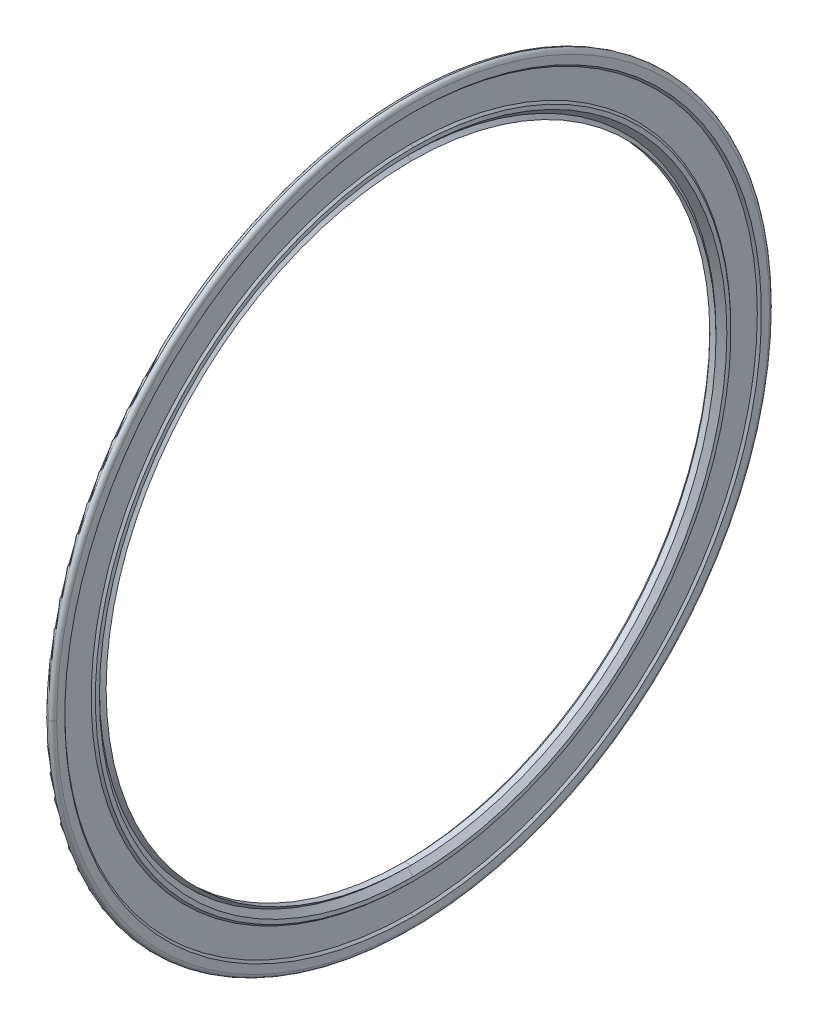
ISO-10303-21;
HEADER;
FILE_DESCRIPTION(('STEP AP214'),'2;1');
FILE_NAME('part.step','',(''),(''),'','','');
FILE_SCHEMA(('AUTOMOTIVE_DESIGN { 1 0 10303 214 1 1 1 1 }'));
ENDSEC;
DATA;
#1=APPLICATION_CONTEXT('core data for automotive mechanical design processes');
#2=APPLICATION_PROTOCOL_DEFINITION('international standard','automotive_design',2000,#1);
#3=PRODUCT_CONTEXT('',#1,'mechanical');
#4=PRODUCT('Part','Part','',(#3));
#5=PRODUCT_RELATED_PRODUCT_CATEGORY('part','',(#4));
#6=PRODUCT_DEFINITION_FORMATION('','',#4);
#7=PRODUCT_DEFINITION_CONTEXT('part definition',#1,'design');
#8=PRODUCT_DEFINITION('design','',#6,#7);
#9=PRODUCT_DEFINITION_SHAPE('','',#8);
#10=(LENGTH_UNIT() NAMED_UNIT(*) SI_UNIT(.MILLI.,.METRE.));
#11=(NAMED_UNIT(*) PLANE_ANGLE_UNIT() SI_UNIT($,.RADIAN.));
#12=(NAMED_UNIT(*) SI_UNIT($,.STERADIAN.) SOLID_ANGLE_UNIT());
#13=UNCERTAINTY_MEASURE_WITH_UNIT(LENGTH_MEASURE(1.E-05),#10,'distance_accuracy_value','');
#14=(GEOMETRIC_REPRESENTATION_CONTEXT(3) GLOBAL_UNCERTAINTY_ASSIGNED_CONTEXT((#13)) GLOBAL_UNIT_ASSIGNED_CONTEXT((#10,
#11,#12)) REPRESENTATION_CONTEXT('',''));
#15=CARTESIAN_POINT('',(0.,0.,0.));
#16=DIRECTION('',(0.,0.,1.));
#17=DIRECTION('',(1.,0.,0.));
#18=AXIS2_PLACEMENT_3D('',#15,#16,#17);
#19=CARTESIAN_POINT('',(3.943,9.732435,0.));
#20=DIRECTION('',(1.,0.,0.));
#21=DIRECTION('',(0.,0.,1.));
#22=AXIS2_PLACEMENT_3D('',#19,#20,#21);
#23=PLANE('',#22);
#24=CARTESIAN_POINT('',(3.943,0.,0.));
#25=DIRECTION('',(-1.,0.,0.));
#26=DIRECTION('',(0.,1.,0.));
#27=AXIS2_PLACEMENT_3D('',#24,#25,#26);
#28=CIRCLE('',#27,9.620035);
#29=CARTESIAN_POINT('',(3.943,9.620035,0.));
#30=VERTEX_POINT('',#29);
#31=CARTESIAN_POINT('',(3.943,-9.620035,0.));
#32=VERTEX_POINT('',#31);
#33=EDGE_CURVE('E11',#30,#32,#28,.T.);
#34=ORIENTED_EDGE('',*,*,#33,.T.);
#35=CARTESIAN_POINT('',(3.943,0.,0.));
#36=DIRECTION('',(-1.,0.,0.));
#37=DIRECTION('',(0.,1.,0.));
#38=AXIS2_PLACEMENT_3D('',#35,#36,#37);
#39=CIRCLE('',#38,9.620035);
#40=EDGE_CURVE('E259',#32,#30,#39,.T.);
#41=ORIENTED_EDGE('',*,*,#40,.T.);
#42=EDGE_LOOP('',(#34,#41));
#43=FACE_BOUND('',#42,.T.);
#44=CARTESIAN_POINT('',(3.943,0.,0.));
#45=DIRECTION('',(-1.,0.,0.));
#46=DIRECTION('',(0.,1.,0.));
#47=AXIS2_PLACEMENT_3D('',#44,#45,#46);
#48=CIRCLE('',#47,9.844835);
#49=CARTESIAN_POINT('',(3.943,0.,9.844835));
#50=VERTEX_POINT('',#49);
#51=CARTESIAN_POINT('',(3.943,0.,-9.844835));
#52=VERTEX_POINT('',#51);
#53=EDGE_CURVE('E224',#50,#52,#48,.T.);
#54=ORIENTED_EDGE('',*,*,#53,.F.);
#55=CARTESIAN_POINT('',(3.943,0.,0.));
#56=DIRECTION('',(-1.,0.,0.));
#57=DIRECTION('',(0.,1.,0.));
#58=AXIS2_PLACEMENT_3D('',#55,#56,#57);
#59=CIRCLE('',#58,9.844835);
#60=EDGE_CURVE('E228',#52,#50,#59,.T.);
#61=ORIENTED_EDGE('',*,*,#60,.F.);
#62=EDGE_LOOP('',(#54,#61));
#63=FACE_BOUND('',#62,.T.);
#64=ADVANCED_FACE('F16',(#43,#63),#23,.T.);
#65=CARTESIAN_POINT('',(3.9145,0.,0.));
#66=DIRECTION('',(1.,0.,0.));
#67=DIRECTION('',(0.,1.,0.));
#68=AXIS2_PLACEMENT_3D('',#65,#66,#67);
#69=CONICAL_SURFACE('',#68,9.591535,0.785398163397451);
#70=DIRECTION('',(-0.707106781186545,-0.70710678118655,0.));
#71=VECTOR('',#70,1.);
#72=CARTESIAN_POINT('',(3.9145,9.591535,0.));
#73=LINE('',#72,#71);
#74=CARTESIAN_POINT('',(3.886,9.563035,0.));
#75=VERTEX_POINT('',#74);
#76=EDGE_CURVE('E234',#30,#75,#73,.T.);
#77=ORIENTED_EDGE('',*,*,#76,.T.);
#78=CARTESIAN_POINT('',(3.886,0.,0.));
#79=DIRECTION('',(-1.,0.,0.));
#80=DIRECTION('',(0.,1.,0.));
#81=AXIS2_PLACEMENT_3D('',#78,#79,#80);
#82=CIRCLE('',#81,9.563035);
#83=CARTESIAN_POINT('',(3.886,-9.563035,0.));
#84=VERTEX_POINT('',#83);
#85=EDGE_CURVE('E19',#75,#84,#82,.T.);
#86=ORIENTED_EDGE('',*,*,#85,.T.);
#87=DIRECTION('',(0.707106781186545,-0.70710678118655,0.));
#88=VECTOR('',#87,1.);
#89=CARTESIAN_POINT('',(3.9145,-9.591535,0.));
#90=LINE('',#89,#88);
#91=EDGE_CURVE('E261',#84,#32,#90,.T.);
#92=ORIENTED_EDGE('',*,*,#91,.T.);
#93=ORIENTED_EDGE('',*,*,#33,.F.);
#94=EDGE_LOOP('',(#77,#86,#92,#93));
#95=FACE_BOUND('',#94,.T.);
#96=ADVANCED_FACE('F207',(#95),#69,.F.);
#97=CARTESIAN_POINT('',(3.886,9.198535,0.));
#98=DIRECTION('',(1.,0.,0.));
#99=DIRECTION('',(0.,0.,1.));
#100=AXIS2_PLACEMENT_3D('',#97,#98,#99);
#101=PLANE('',#100);
#102=CARTESIAN_POINT('',(3.886,0.,0.));
#103=DIRECTION('',(-1.,0.,0.));
#104=DIRECTION('',(0.,1.,0.));
#105=AXIS2_PLACEMENT_3D('',#102,#103,#104);
#106=CIRCLE('',#105,8.834035);
#107=CARTESIAN_POINT('',(3.886,8.834035,0.));
#108=VERTEX_POINT('',#107);
#109=CARTESIAN_POINT('',(3.886,-8.834035,0.));
#110=VERTEX_POINT('',#109);
#111=EDGE_CURVE('E253',#108,#110,#106,.T.);
#112=ORIENTED_EDGE('',*,*,#111,.T.);
#113=CARTESIAN_POINT('',(3.886,0.,0.));
#114=DIRECTION('',(-1.,0.,0.));
#115=DIRECTION('',(0.,1.,0.));
#116=AXIS2_PLACEMENT_3D('',#113,#114,#115);
#117=CIRCLE('',#116,8.834035);
#118=EDGE_CURVE('E118',#110,#108,#117,.T.);
#119=ORIENTED_EDGE('',*,*,#118,.T.);
#120=EDGE_LOOP('',(#112,#119));
#121=FACE_BOUND('',#120,.T.);
#122=ORIENTED_EDGE('',*,*,#85,.F.);
#123=CARTESIAN_POINT('',(3.886,0.,0.));
#124=DIRECTION('',(-1.,0.,0.));
#125=DIRECTION('',(0.,1.,0.));
#126=AXIS2_PLACEMENT_3D('',#123,#124,#125);
#127=CIRCLE('',#126,9.563035);
#128=EDGE_CURVE('E268',#84,#75,#127,.T.);
#129=ORIENTED_EDGE('',*,*,#128,.F.);
#130=EDGE_LOOP('',(#122,#129));
#131=FACE_BOUND('',#130,.T.);
#132=ADVANCED_FACE('F212',(#121,#131),#101,.T.);
#133=CARTESIAN_POINT('',(3.9145,0.,0.));
#134=DIRECTION('',(-1.,0.,0.));
#135=DIRECTION('',(0.,1.,0.));
#136=AXIS2_PLACEMENT_3D('',#133,#134,#135);
#137=CONICAL_SURFACE('',#136,8.805535,0.785398163397451);
#138=DIRECTION('',(-0.707106781186545,0.70710678118655,0.));
#139=VECTOR('',#138,1.);
#140=CARTESIAN_POINT('',(3.9145,8.805535,0.));
#141=LINE('',#140,#139);
#142=CARTESIAN_POINT('',(3.943,8.777035,0.));
#143=VERTEX_POINT('',#142);
#144=EDGE_CURVE('E272',#143,#108,#141,.T.);
#145=ORIENTED_EDGE('',*,*,#144,.T.);
#146=ORIENTED_EDGE('',*,*,#118,.F.);
#147=DIRECTION('',(0.707106781186545,0.70710678118655,0.));
#148=VECTOR('',#147,1.);
#149=CARTESIAN_POINT('',(3.9145,-8.805535,0.));
#150=LINE('',#149,#148);
#151=CARTESIAN_POINT('',(3.943,-8.777035,0.));
#152=VERTEX_POINT('',#151);
#153=EDGE_CURVE('E277',#110,#152,#150,.T.);
#154=ORIENTED_EDGE('',*,*,#153,.T.);
#155=CARTESIAN_POINT('',(3.943,0.,0.));
#156=DIRECTION('',(-1.,0.,0.));
#157=DIRECTION('',(0.,1.,0.));
#158=AXIS2_PLACEMENT_3D('',#155,#156,#157);
#159=CIRCLE('',#158,8.777035);
#160=EDGE_CURVE('E120',#152,#143,#159,.T.);
#161=ORIENTED_EDGE('',*,*,#160,.T.);
#162=EDGE_LOOP('',(#145,#146,#154,#161));
#163=FACE_BOUND('',#162,.T.);
#164=ADVANCED_FACE('F509',(#163),#137,.T.);
#165=CARTESIAN_POINT('',(3.943,8.720835,0.));
#166=DIRECTION('',(1.,0.,0.));
#167=DIRECTION('',(0.,0.,1.));
#168=AXIS2_PLACEMENT_3D('',#165,#166,#167);
#169=PLANE('',#168);
#170=CARTESIAN_POINT('',(3.943,0.,0.));
#171=DIRECTION('',(-1.,0.,0.));
#172=DIRECTION('',(0.,1.,0.));
#173=AXIS2_PLACEMENT_3D('',#170,#171,#172);
#174=CIRCLE('',#173,8.664635);
#175=CARTESIAN_POINT('',(3.943,8.664635,0.));
#176=VERTEX_POINT('',#175);
#177=CARTESIAN_POINT('',(3.943,-8.664635,0.));
#178=VERTEX_POINT('',#177);
#179=EDGE_CURVE('E128',#176,#178,#174,.T.);
#180=ORIENTED_EDGE('',*,*,#179,.T.);
#181=CARTESIAN_POINT('',(3.943,0.,0.));
#182=DIRECTION('',(-1.,0.,0.));
#183=DIRECTION('',(0.,1.,0.));
#184=AXIS2_PLACEMENT_3D('',#181,#182,#183);
#185=CIRCLE('',#184,8.664635);
#186=EDGE_CURVE('E262',#178,#176,#185,.T.);
#187=ORIENTED_EDGE('',*,*,#186,.T.);
#188=EDGE_LOOP('',(#180,#187));
#189=FACE_BOUND('',#188,.T.);
#190=CARTESIAN_POINT('',(3.943,0.,0.));
#191=DIRECTION('',(-1.,0.,0.));
#192=DIRECTION('',(0.,1.,0.));
#193=AXIS2_PLACEMENT_3D('',#190,#191,#192);
#194=CIRCLE('',#193,8.777035);
#195=EDGE_CURVE('E274',#143,#152,#194,.T.);
#196=ORIENTED_EDGE('',*,*,#195,.F.);
#197=ORIENTED_EDGE('',*,*,#160,.F.);
#198=EDGE_LOOP('',(#196,#197));
#199=FACE_BOUND('',#198,.T.);
#200=ADVANCED_FACE('F297',(#189,#199),#169,.T.);
#201=CARTESIAN_POINT('',(3.86798375,0.,0.));
#202=DIRECTION('',(1.,0.,0.));
#203=DIRECTION('',(0.,1.,0.));
#204=AXIS2_PLACEMENT_3D('',#201,#202,#203);
#205=CONICAL_SURFACE('',#204,8.58961875,0.785398163397449);
#206=DIRECTION('',(-0.707106781186547,-0.707106781186548,0.));
#207=VECTOR('',#206,1.);
#208=CARTESIAN_POINT('',(3.86798375,8.58961875,0.));
#209=LINE('',#208,#207);
#210=CARTESIAN_POINT('',(3.7929675,8.5146025,0.));
#211=VERTEX_POINT('',#210);
#212=EDGE_CURVE('E266',#176,#211,#209,.T.);
#213=ORIENTED_EDGE('',*,*,#212,.T.);
#214=CARTESIAN_POINT('',(3.7929675,0.,0.));
#215=DIRECTION('',(-1.,0.,0.));
#216=DIRECTION('',(0.,1.,0.));
#217=AXIS2_PLACEMENT_3D('',#214,#215,#216);
#218=CIRCLE('',#217,8.5146025);
#219=CARTESIAN_POINT('',(3.7929675,-8.5146025,0.));
#220=VERTEX_POINT('',#219);
#221=EDGE_CURVE('E151',#211,#220,#218,.T.);
#222=ORIENTED_EDGE('',*,*,#221,.T.);
#223=DIRECTION('',(0.707106781186547,-0.707106781186548,0.));
#224=VECTOR('',#223,1.);
#225=CARTESIAN_POINT('',(3.86798375,-8.58961875,0.));
#226=LINE('',#225,#224);
#227=EDGE_CURVE('E265',#220,#178,#226,.T.);
#228=ORIENTED_EDGE('',*,*,#227,.T.);
#229=ORIENTED_EDGE('',*,*,#179,.F.);
#230=EDGE_LOOP('',(#213,#222,#228,#229));
#231=FACE_BOUND('',#230,.T.);
#232=ADVANCED_FACE('F293',(#231),#205,.F.);
#233=CARTESIAN_POINT('',(3.83948375,0.,0.));
#234=DIRECTION('',(-1.,0.,0.));
#235=DIRECTION('',(0.,1.,0.));
#236=AXIS2_PLACEMENT_3D('',#233,#234,#235);
#237=CONICAL_SURFACE('',#236,8.46808625,0.785398163397448);
#238=DIRECTION('',(-0.707106781186548,0.707106781186547,0.));
#239=VECTOR('',#238,1.);
#240=CARTESIAN_POINT('',(3.83948375,8.46808625,0.));
#241=LINE('',#240,#239);
#242=CARTESIAN_POINT('',(3.886,8.42157,0.));
#243=VERTEX_POINT('',#242);
#244=EDGE_CURVE('E142',#243,#211,#241,.T.);
#245=ORIENTED_EDGE('',*,*,#244,.T.);
#246=CARTESIAN_POINT('',(3.7929675,0.,0.));
#247=DIRECTION('',(-1.,0.,0.));
#248=DIRECTION('',(0.,1.,0.));
#249=AXIS2_PLACEMENT_3D('',#246,#247,#248);
#250=CIRCLE('',#249,8.5146025);
#251=EDGE_CURVE('E140',#220,#211,#250,.T.);
#252=ORIENTED_EDGE('',*,*,#251,.F.);
#253=DIRECTION('',(0.707106781186548,0.707106781186547,0.));
#254=VECTOR('',#253,1.);
#255=CARTESIAN_POINT('',(3.83948375,-8.46808625,0.));
#256=LINE('',#255,#254);
#257=CARTESIAN_POINT('',(3.886,-8.42157,0.));
#258=VERTEX_POINT('',#257);
#259=EDGE_CURVE('E148',#220,#258,#256,.T.);
#260=ORIENTED_EDGE('',*,*,#259,.T.);
#261=CARTESIAN_POINT('',(3.886,0.,0.));
#262=DIRECTION('',(-1.,0.,0.));
#263=DIRECTION('',(0.,1.,0.));
#264=AXIS2_PLACEMENT_3D('',#261,#262,#263);
#265=CIRCLE('',#264,8.42157);
#266=EDGE_CURVE('E156',#258,#243,#265,.T.);
#267=ORIENTED_EDGE('',*,*,#266,.T.);
#268=EDGE_LOOP('',(#245,#252,#260,#267));
#269=FACE_BOUND('',#268,.T.);
#270=ADVANCED_FACE('F486',(#269),#237,.T.);
#271=CARTESIAN_POINT('',(3.8005,0.,0.));
#272=DIRECTION('',(-1.,0.,0.));
#273=DIRECTION('',(0.,1.,0.));
#274=AXIS2_PLACEMENT_3D('',#271,#272,#273);
#275=CYLINDRICAL_SURFACE('',#274,8.42157);
#276=DIRECTION('',(-1.,0.,0.));
#277=VECTOR('',#276,1.);
#278=CARTESIAN_POINT('',(3.8005,8.42157,0.));
#279=LINE('',#278,#277);
#280=CARTESIAN_POINT('',(3.715,8.42157,0.));
#281=VERTEX_POINT('',#280);
#282=EDGE_CURVE('E153',#243,#281,#279,.T.);
#283=ORIENTED_EDGE('',*,*,#282,.T.);
#284=CARTESIAN_POINT('',(3.715,0.,0.));
#285=DIRECTION('',(-1.,0.,0.));
#286=DIRECTION('',(0.,1.,0.));
#287=AXIS2_PLACEMENT_3D('',#284,#285,#286);
#288=CIRCLE('',#287,8.42157);
#289=CARTESIAN_POINT('',(3.715,-8.42157,0.));
#290=VERTEX_POINT('',#289);
#291=EDGE_CURVE('E109',#281,#290,#288,.T.);
#292=ORIENTED_EDGE('',*,*,#291,.T.);
#293=DIRECTION('',(1.,0.,0.));
#294=VECTOR('',#293,1.);
#295=CARTESIAN_POINT('',(3.8005,-8.42157,0.));
#296=LINE('',#295,#294);
#297=EDGE_CURVE('E158',#290,#258,#296,.T.);
#298=ORIENTED_EDGE('',*,*,#297,.T.);
#299=CARTESIAN_POINT('',(3.886,0.,0.));
#300=DIRECTION('',(-1.,0.,0.));
#301=DIRECTION('',(0.,1.,0.));
#302=AXIS2_PLACEMENT_3D('',#299,#300,#301);
#303=CIRCLE('',#302,8.42157);
#304=EDGE_CURVE('E145',#243,#258,#303,.T.);
#305=ORIENTED_EDGE('',*,*,#304,.F.);
#306=EDGE_LOOP('',(#283,#292,#298,#305));
#307=FACE_BOUND('',#306,.T.);
#308=ADVANCED_FACE('F478',(#307),#275,.F.);
#309=CARTESIAN_POINT('',(3.66848375,0.,0.));
#310=DIRECTION('',(-1.,0.,0.));
#311=DIRECTION('',(0.,1.,0.));
#312=AXIS2_PLACEMENT_3D('',#309,#310,#311);
#313=CONICAL_SURFACE('',#312,8.46808625,0.785398163397444);
#314=DIRECTION('',(-0.707106781186551,0.707106781186544,0.));
#315=VECTOR('',#314,1.);
#316=CARTESIAN_POINT('',(3.66848375,8.46808625,0.));
#317=LINE('',#316,#315);
#318=CARTESIAN_POINT('',(3.6219675,8.5146025,0.));
#319=VERTEX_POINT('',#318);
#320=EDGE_CURVE('E163',#281,#319,#317,.T.);
#321=ORIENTED_EDGE('',*,*,#320,.T.);
#322=CARTESIAN_POINT('',(3.6219675,0.,0.));
#323=DIRECTION('',(-1.,0.,0.));
#324=DIRECTION('',(0.,1.,0.));
#325=AXIS2_PLACEMENT_3D('',#322,#323,#324);
#326=CIRCLE('',#325,8.5146025);
#327=CARTESIAN_POINT('',(3.6219675,-8.5146025,0.));
#328=VERTEX_POINT('',#327);
#329=EDGE_CURVE('E179',#319,#328,#326,.T.);
#330=ORIENTED_EDGE('',*,*,#329,.T.);
#331=DIRECTION('',(0.707106781186551,0.707106781186544,0.));
#332=VECTOR('',#331,1.);
#333=CARTESIAN_POINT('',(3.66848375,-8.46808625,0.));
#334=LINE('',#333,#332);
#335=EDGE_CURVE('E166',#328,#290,#334,.T.);
#336=ORIENTED_EDGE('',*,*,#335,.T.);
#337=ORIENTED_EDGE('',*,*,#291,.F.);
#338=EDGE_LOOP('',(#321,#330,#336,#337));
#339=FACE_BOUND('',#338,.T.);
#340=ADVANCED_FACE('F337',(#339),#313,.F.);
#341=CARTESIAN_POINT('',(3.69698375,0.,0.));
#342=DIRECTION('',(1.,0.,0.));
#343=DIRECTION('',(0.,1.,0.));
#344=AXIS2_PLACEMENT_3D('',#341,#342,#343);
#345=CONICAL_SURFACE('',#344,8.58961875,0.785398163397446);
#346=DIRECTION('',(-0.707106781186549,-0.707106781186546,0.));
#347=VECTOR('',#346,1.);
#348=CARTESIAN_POINT('',(3.69698375,8.58961875,0.));
#349=LINE('',#348,#347);
#350=CARTESIAN_POINT('',(3.772,8.664635,0.));
#351=VERTEX_POINT('',#350);
#352=EDGE_CURVE('E172',#351,#319,#349,.T.);
#353=ORIENTED_EDGE('',*,*,#352,.T.);
#354=CARTESIAN_POINT('',(3.6219675,0.,0.));
#355=DIRECTION('',(-1.,0.,0.));
#356=DIRECTION('',(0.,1.,0.));
#357=AXIS2_PLACEMENT_3D('',#354,#355,#356);
#358=CIRCLE('',#357,8.5146025);
#359=EDGE_CURVE('E169',#328,#319,#358,.T.);
#360=ORIENTED_EDGE('',*,*,#359,.F.);
#361=DIRECTION('',(0.707106781186549,-0.707106781186546,0.));
#362=VECTOR('',#361,1.);
#363=CARTESIAN_POINT('',(3.69698375,-8.58961875,0.));
#364=LINE('',#363,#362);
#365=CARTESIAN_POINT('',(3.772,-8.664635,0.));
#366=VERTEX_POINT('',#365);
#367=EDGE_CURVE('E178',#328,#366,#364,.T.);
#368=ORIENTED_EDGE('',*,*,#367,.T.);
#369=CARTESIAN_POINT('',(3.772,0.,0.));
#370=DIRECTION('',(-1.,0.,0.));
#371=DIRECTION('',(0.,1.,0.));
#372=AXIS2_PLACEMENT_3D('',#369,#370,#371);
#373=CIRCLE('',#372,8.664635);
#374=EDGE_CURVE('E182',#366,#351,#373,.T.);
#375=ORIENTED_EDGE('',*,*,#374,.T.);
#376=EDGE_LOOP('',(#353,#360,#368,#375));
#377=FACE_BOUND('',#376,.T.);
#378=ADVANCED_FACE('F202',(#377),#345,.T.);
#379=CARTESIAN_POINT('',(3.715,0.,0.));
#380=DIRECTION('',(-1.,0.,0.));
#381=DIRECTION('',(0.,1.,0.));
#382=AXIS2_PLACEMENT_3D('',#379,#380,#381);
#383=CONICAL_SURFACE('',#382,8.721635,0.785398163397451);
#384=DIRECTION('',(-0.707106781186546,0.70710678118655,0.));
#385=VECTOR('',#384,1.);
#386=CARTESIAN_POINT('',(3.715,8.721635,0.));
#387=LINE('',#386,#385);
#388=CARTESIAN_POINT('',(3.658,8.778635,0.));
#389=VERTEX_POINT('',#388);
#390=EDGE_CURVE('E181',#351,#389,#387,.T.);
#391=ORIENTED_EDGE('',*,*,#390,.T.);
#392=CARTESIAN_POINT('',(3.658,0.,0.));
#393=DIRECTION('',(-1.,0.,0.));
#394=DIRECTION('',(0.,1.,0.));
#395=AXIS2_PLACEMENT_3D('',#392,#393,#394);
#396=CIRCLE('',#395,8.778635);
#397=CARTESIAN_POINT('',(3.658,-8.778635,0.));
#398=VERTEX_POINT('',#397);
#399=EDGE_CURVE('E117',#389,#398,#396,.T.);
#400=ORIENTED_EDGE('',*,*,#399,.T.);
#401=DIRECTION('',(0.707106781186546,0.70710678118655,0.));
#402=VECTOR('',#401,1.);
#403=CARTESIAN_POINT('',(3.715,-8.721635,0.));
#404=LINE('',#403,#402);
#405=EDGE_CURVE('E184',#398,#366,#404,.T.);
#406=ORIENTED_EDGE('',*,*,#405,.T.);
#407=CARTESIAN_POINT('',(3.772,0.,0.));
#408=DIRECTION('',(-1.,0.,0.));
#409=DIRECTION('',(0.,1.,0.));
#410=AXIS2_PLACEMENT_3D('',#407,#408,#409);
#411=CIRCLE('',#410,8.664635);
#412=EDGE_CURVE('E175',#351,#366,#411,.T.);
#413=ORIENTED_EDGE('',*,*,#412,.F.);
#414=EDGE_LOOP('',(#391,#400,#406,#413));
#415=FACE_BOUND('',#414,.T.);
#416=ADVANCED_FACE('F193',(#415),#383,.F.);
#417=CARTESIAN_POINT('',(3.658,9.15509032196187,0.));
#418=DIRECTION('',(-1.,0.,0.));
#419=DIRECTION('',(0.,0.,1.));
#420=AXIS2_PLACEMENT_3D('',#417,#418,#419);
#421=PLANE('',#420);
#422=ORIENTED_EDGE('',*,*,#399,.F.);
#423=CARTESIAN_POINT('',(3.658,0.,0.));
#424=DIRECTION('',(-1.,0.,0.));
#425=DIRECTION('',(0.,1.,0.));
#426=AXIS2_PLACEMENT_3D('',#423,#424,#425);
#427=CIRCLE('',#426,8.778635);
#428=EDGE_CURVE('E187',#398,#389,#427,.T.);
#429=ORIENTED_EDGE('',*,*,#428,.F.);
#430=EDGE_LOOP('',(#422,#429));
#431=FACE_BOUND('',#430,.T.);
#432=CARTESIAN_POINT('',(3.658,0.,0.));
#433=DIRECTION('',(-1.,0.,0.));
#434=DIRECTION('',(0.,1.,0.));
#435=AXIS2_PLACEMENT_3D('',#432,#433,#434);
#436=CIRCLE('',#435,9.53154564392374);
#437=CARTESIAN_POINT('',(3.658,9.53154564392374,0.));
#438=VERTEX_POINT('',#437);
#439=CARTESIAN_POINT('',(3.658,-9.53154564392375,0.));
#440=VERTEX_POINT('',#439);
#441=EDGE_CURVE('E99',#438,#440,#436,.T.);
#442=ORIENTED_EDGE('',*,*,#441,.T.);
#443=CARTESIAN_POINT('',(3.658,0.,0.));
#444=DIRECTION('',(-1.,0.,0.));
#445=DIRECTION('',(0.,1.,0.));
#446=AXIS2_PLACEMENT_3D('',#443,#444,#445);
#447=CIRCLE('',#446,9.53154564392374);
#448=EDGE_CURVE('E90',#440,#438,#447,.T.);
#449=ORIENTED_EDGE('',*,*,#448,.T.);
#450=EDGE_LOOP('',(#442,#449));
#451=FACE_BOUND('',#450,.T.);
#452=ADVANCED_FACE('F191',(#431,#451),#421,.T.);
#453=CARTESIAN_POINT('',(3.6873659580783,0.,0.));
#454=DIRECTION('',(1.,0.,0.));
#455=DIRECTION('',(0.,1.,0.));
#456=AXIS2_PLACEMENT_3D('',#453,#454,#455);
#457=CONICAL_SURFACE('',#456,9.69808826808889,1.39626340159546);
#458=DIRECTION('',(-0.173648177666929,-0.984807753012208,0.));
#459=VECTOR('',#458,1.);
#460=CARTESIAN_POINT('',(3.6873659580783,9.69808826808889,0.));
#461=LINE('',#460,#459);
#462=CARTESIAN_POINT('',(3.71673191615661,9.86463089225403,0.));
#463=VERTEX_POINT('',#462);
#464=EDGE_CURVE('E106',#463,#438,#461,.T.);
#465=ORIENTED_EDGE('',*,*,#464,.T.);
#466=ORIENTED_EDGE('',*,*,#448,.F.);
#467=DIRECTION('',(0.173648177666929,-0.984807753012208,0.));
#468=VECTOR('',#467,1.);
#469=CARTESIAN_POINT('',(3.6873659580783,-9.69808826808889,0.));
#470=LINE('',#469,#468);
#471=CARTESIAN_POINT('',(3.71673191615661,-9.86463089225403,0.));
#472=VERTEX_POINT('',#471);
#473=EDGE_CURVE('E93',#440,#472,#470,.T.);
#474=ORIENTED_EDGE('',*,*,#473,.T.);
#475=CARTESIAN_POINT('',(3.71673191615661,0.,0.));
#476=DIRECTION('',(-1.,0.,0.));
#477=DIRECTION('',(0.,1.,0.));
#478=AXIS2_PLACEMENT_3D('',#475,#476,#477);
#479=CIRCLE('',#478,9.86463089225403);
#480=CARTESIAN_POINT('',(3.71673191615661,0.,9.86463089225403));
#481=VERTEX_POINT('',#480);
#482=EDGE_CURVE('E32',#472,#481,#479,.T.);
#483=ORIENTED_EDGE('',*,*,#482,.T.);
#484=CARTESIAN_POINT('',(3.71673191615661,0.,0.));
#485=DIRECTION('',(-1.,0.,0.));
#486=DIRECTION('',(0.,1.,0.));
#487=AXIS2_PLACEMENT_3D('',#484,#485,#486);
#488=CIRCLE('',#487,9.86463089225403);
#489=EDGE_CURVE('E114',#481,#463,#488,.T.);
#490=ORIENTED_EDGE('',*,*,#489,.T.);
#491=EDGE_LOOP('',(#465,#466,#474,#483,#490));
#492=FACE_BOUND('',#491,.T.);
#493=ADVANCED_FACE('F95',(#492),#457,.T.);
#494=CARTESIAN_POINT('',(3.829,0.,0.));
#495=DIRECTION('',(-1.,0.,0.));
#496=DIRECTION('',(0.,0.,1.));
#497=AXIS2_PLACEMENT_3D('',#494,#495,#496);
#498=TOROIDAL_SURFACE('',#497,9.844835,0.114);
#499=CARTESIAN_POINT('',(3.829,0.,0.));
#500=DIRECTION('',(-1.,0.,0.));
#501=DIRECTION('',(0.,0.,1.));
#502=AXIS2_PLACEMENT_3D('',#499,#500,#501);
#503=CIRCLE('',#502,9.958835);
#504=CARTESIAN_POINT('',(3.829,0.,-9.958835));
#505=VERTEX_POINT('',#504);
#506=CARTESIAN_POINT('',(3.829,0.,9.958835));
#507=VERTEX_POINT('',#506);
#508=EDGE_CURVE('E249',#505,#507,#503,.T.);
#509=ORIENTED_EDGE('',*,*,#508,.T.);
#510=CARTESIAN_POINT('',(3.829,0.,9.844835));
#511=DIRECTION('',(0.,-1.,0.));
#512=DIRECTION('',(0.,0.,1.));
#513=AXIS2_PLACEMENT_3D('',#510,#511,#512);
#514=CIRCLE('',#513,0.114);
#515=EDGE_CURVE('E88',#507,#481,#514,.T.);
#516=ORIENTED_EDGE('',*,*,#515,.T.);
#517=ORIENTED_EDGE('',*,*,#482,.F.);
#518=CARTESIAN_POINT('',(3.71673191615661,0.,0.));
#519=DIRECTION('',(-1.,0.,0.));
#520=DIRECTION('',(0.,1.,0.));
#521=AXIS2_PLACEMENT_3D('',#518,#519,#520);
#522=CIRCLE('',#521,9.86463089225403);
#523=CARTESIAN_POINT('',(3.71673191615661,0.,-9.86463089225403));
#524=VERTEX_POINT('',#523);
#525=EDGE_CURVE('E85',#524,#472,#522,.T.);
#526=ORIENTED_EDGE('',*,*,#525,.F.);
#527=CARTESIAN_POINT('',(3.829,0.,-9.844835));
#528=DIRECTION('',(0.,-1.,0.));
#529=DIRECTION('',(0.,0.,-1.));
#530=AXIS2_PLACEMENT_3D('',#527,#528,#529);
#531=CIRCLE('',#530,0.114);
#532=EDGE_CURVE('E112',#524,#505,#531,.T.);
#533=ORIENTED_EDGE('',*,*,#532,.T.);
#534=EDGE_LOOP('',(#509,#516,#517,#526,#533));
#535=FACE_BOUND('',#534,.T.);
#536=ADVANCED_FACE('F82',(#535),#498,.T.);
#537=CARTESIAN_POINT('',(3.829,0.,0.));
#538=DIRECTION('',(-1.,0.,0.));
#539=DIRECTION('',(0.,0.,1.));
#540=AXIS2_PLACEMENT_3D('',#537,#538,#539);
#541=TOROIDAL_SURFACE('',#540,9.844835,0.114);
#542=CARTESIAN_POINT('',(3.829,0.,0.));
#543=DIRECTION('',(-1.,0.,0.));
#544=DIRECTION('',(0.,0.,1.));
#545=AXIS2_PLACEMENT_3D('',#542,#543,#544);
#546=CIRCLE('',#545,9.958835);
#547=EDGE_CURVE('E235',#507,#505,#546,.T.);
#548=ORIENTED_EDGE('',*,*,#547,.T.);
#549=ORIENTED_EDGE('',*,*,#532,.F.);
#550=CARTESIAN_POINT('',(3.71673191615661,0.,0.));
#551=DIRECTION('',(-1.,0.,0.));
#552=DIRECTION('',(0.,1.,0.));
#553=AXIS2_PLACEMENT_3D('',#550,#551,#552);
#554=CIRCLE('',#553,9.86463089225403);
#555=EDGE_CURVE('E104',#463,#524,#554,.T.);
#556=ORIENTED_EDGE('',*,*,#555,.F.);
#557=ORIENTED_EDGE('',*,*,#489,.F.);
#558=ORIENTED_EDGE('',*,*,#515,.F.);
#559=EDGE_LOOP('',(#548,#549,#556,#557,#558));
#560=FACE_BOUND('',#559,.T.);
#561=ADVANCED_FACE('F345',(#560),#541,.T.);
#562=CARTESIAN_POINT('',(3.6873659580783,0.,0.));
#563=DIRECTION('',(1.,0.,0.));
#564=DIRECTION('',(0.,1.,0.));
#565=AXIS2_PLACEMENT_3D('',#562,#563,#564);
#566=CONICAL_SURFACE('',#565,9.69808826808889,1.39626340159546);
#567=ORIENTED_EDGE('',*,*,#464,.F.);
#568=ORIENTED_EDGE('',*,*,#555,.T.);
#569=ORIENTED_EDGE('',*,*,#525,.T.);
#570=ORIENTED_EDGE('',*,*,#473,.F.);
#571=ORIENTED_EDGE('',*,*,#441,.F.);
#572=EDGE_LOOP('',(#567,#568,#569,#570,#571));
#573=FACE_BOUND('',#572,.T.);
#574=ADVANCED_FACE('F102',(#573),#566,.T.);
#575=CARTESIAN_POINT('',(3.715,0.,0.));
#576=DIRECTION('',(-1.,0.,0.));
#577=DIRECTION('',(0.,1.,0.));
#578=AXIS2_PLACEMENT_3D('',#575,#576,#577);
#579=CONICAL_SURFACE('',#578,8.721635,0.785398163397451);
#580=ORIENTED_EDGE('',*,*,#390,.F.);
#581=ORIENTED_EDGE('',*,*,#374,.F.);
#582=ORIENTED_EDGE('',*,*,#405,.F.);
#583=ORIENTED_EDGE('',*,*,#428,.T.);
#584=EDGE_LOOP('',(#580,#581,#582,#583));
#585=FACE_BOUND('',#584,.T.);
#586=ADVANCED_FACE('F344',(#585),#579,.F.);
#587=CARTESIAN_POINT('',(3.69698375,0.,0.));
#588=DIRECTION('',(1.,0.,0.));
#589=DIRECTION('',(0.,1.,0.));
#590=AXIS2_PLACEMENT_3D('',#587,#588,#589);
#591=CONICAL_SURFACE('',#590,8.58961875,0.785398163397446);
#592=ORIENTED_EDGE('',*,*,#352,.F.);
#593=ORIENTED_EDGE('',*,*,#412,.T.);
#594=ORIENTED_EDGE('',*,*,#367,.F.);
#595=ORIENTED_EDGE('',*,*,#329,.F.);
#596=EDGE_LOOP('',(#592,#593,#594,#595));
#597=FACE_BOUND('',#596,.T.);
#598=ADVANCED_FACE('F347',(#597),#591,.T.);
#599=CARTESIAN_POINT('',(3.66848375,0.,0.));
#600=DIRECTION('',(-1.,0.,0.));
#601=DIRECTION('',(0.,1.,0.));
#602=AXIS2_PLACEMENT_3D('',#599,#600,#601);
#603=CONICAL_SURFACE('',#602,8.46808625,0.785398163397444);
#604=ORIENTED_EDGE('',*,*,#320,.F.);
#605=CARTESIAN_POINT('',(3.715,0.,0.));
#606=DIRECTION('',(-1.,0.,0.));
#607=DIRECTION('',(0.,1.,0.));
#608=AXIS2_PLACEMENT_3D('',#605,#606,#607);
#609=CIRCLE('',#608,8.42157);
#610=EDGE_CURVE('E160',#290,#281,#609,.T.);
#611=ORIENTED_EDGE('',*,*,#610,.F.);
#612=ORIENTED_EDGE('',*,*,#335,.F.);
#613=ORIENTED_EDGE('',*,*,#359,.T.);
#614=EDGE_LOOP('',(#604,#611,#612,#613));
#615=FACE_BOUND('',#614,.T.);
#616=ADVANCED_FACE('F352',(#615),#603,.F.);
#617=CARTESIAN_POINT('',(3.8005,0.,0.));
#618=DIRECTION('',(-1.,0.,0.));
#619=DIRECTION('',(0.,1.,0.));
#620=AXIS2_PLACEMENT_3D('',#617,#618,#619);
#621=CYLINDRICAL_SURFACE('',#620,8.42157);
#622=ORIENTED_EDGE('',*,*,#282,.F.);
#623=ORIENTED_EDGE('',*,*,#266,.F.);
#624=ORIENTED_EDGE('',*,*,#297,.F.);
#625=ORIENTED_EDGE('',*,*,#610,.T.);
#626=EDGE_LOOP('',(#622,#623,#624,#625));
#627=FACE_BOUND('',#626,.T.);
#628=ADVANCED_FACE('F386',(#627),#621,.F.);
#629=CARTESIAN_POINT('',(3.83948375,0.,0.));
#630=DIRECTION('',(-1.,0.,0.));
#631=DIRECTION('',(0.,1.,0.));
#632=AXIS2_PLACEMENT_3D('',#629,#630,#631);
#633=CONICAL_SURFACE('',#632,8.46808625,0.785398163397448);
#634=ORIENTED_EDGE('',*,*,#244,.F.);
#635=ORIENTED_EDGE('',*,*,#304,.T.);
#636=ORIENTED_EDGE('',*,*,#259,.F.);
#637=ORIENTED_EDGE('',*,*,#221,.F.);
#638=EDGE_LOOP('',(#634,#635,#636,#637));
#639=FACE_BOUND('',#638,.T.);
#640=ADVANCED_FACE('F341',(#639),#633,.T.);
#641=CARTESIAN_POINT('',(3.86798375,0.,0.));
#642=DIRECTION('',(1.,0.,0.));
#643=DIRECTION('',(0.,1.,0.));
#644=AXIS2_PLACEMENT_3D('',#641,#642,#643);
#645=CONICAL_SURFACE('',#644,8.58961875,0.785398163397449);
#646=ORIENTED_EDGE('',*,*,#212,.F.);
#647=ORIENTED_EDGE('',*,*,#186,.F.);
#648=ORIENTED_EDGE('',*,*,#227,.F.);
#649=ORIENTED_EDGE('',*,*,#251,.T.);
#650=EDGE_LOOP('',(#646,#647,#648,#649));
#651=FACE_BOUND('',#650,.T.);
#652=ADVANCED_FACE('F289',(#651),#645,.F.);
#653=CARTESIAN_POINT('',(3.9145,0.,0.));
#654=DIRECTION('',(-1.,0.,0.));
#655=DIRECTION('',(0.,1.,0.));
#656=AXIS2_PLACEMENT_3D('',#653,#654,#655);
#657=CONICAL_SURFACE('',#656,8.805535,0.785398163397451);
#658=ORIENTED_EDGE('',*,*,#144,.F.);
#659=ORIENTED_EDGE('',*,*,#195,.T.);
#660=ORIENTED_EDGE('',*,*,#153,.F.);
#661=ORIENTED_EDGE('',*,*,#111,.F.);
#662=EDGE_LOOP('',(#658,#659,#660,#661));
#663=FACE_BOUND('',#662,.T.);
#664=ADVANCED_FACE('F324',(#663),#657,.T.);
#665=CARTESIAN_POINT('',(3.9145,0.,0.));
#666=DIRECTION('',(1.,0.,0.));
#667=DIRECTION('',(0.,1.,0.));
#668=AXIS2_PLACEMENT_3D('',#665,#666,#667);
#669=CONICAL_SURFACE('',#668,9.591535,0.785398163397451);
#670=ORIENTED_EDGE('',*,*,#76,.F.);
#671=ORIENTED_EDGE('',*,*,#40,.F.);
#672=ORIENTED_EDGE('',*,*,#91,.F.);
#673=ORIENTED_EDGE('',*,*,#128,.T.);
#674=EDGE_LOOP('',(#670,#671,#672,#673));
#675=FACE_BOUND('',#674,.T.);
#676=ADVANCED_FACE('F321',(#675),#669,.F.);
#677=CARTESIAN_POINT('',(3.829,0.,0.));
#678=DIRECTION('',(-1.,0.,0.));
#679=DIRECTION('',(0.,0.,1.));
#680=AXIS2_PLACEMENT_3D('',#677,#678,#679);
#681=TOROIDAL_SURFACE('',#680,9.844835,0.114);
#682=ORIENTED_EDGE('',*,*,#547,.F.);
#683=CARTESIAN_POINT('',(3.829,0.,9.844835));
#684=DIRECTION('',(0.,-1.,0.));
#685=DIRECTION('',(0.,0.,1.));
#686=AXIS2_PLACEMENT_3D('',#683,#684,#685);
#687=CIRCLE('',#686,0.114);
#688=EDGE_CURVE('E239',#50,#507,#687,.T.);
#689=ORIENTED_EDGE('',*,*,#688,.F.);
#690=ORIENTED_EDGE('',*,*,#53,.T.);
#691=CARTESIAN_POINT('',(3.829,0.,-9.844835));
#692=DIRECTION('',(0.,-1.,0.));
#693=DIRECTION('',(0.,0.,-1.));
#694=AXIS2_PLACEMENT_3D('',#691,#692,#693);
#695=CIRCLE('',#694,0.114);
#696=EDGE_CURVE('E247',#505,#52,#695,.T.);
#697=ORIENTED_EDGE('',*,*,#696,.F.);
#698=EDGE_LOOP('',(#682,#689,#690,#697));
#699=FACE_BOUND('',#698,.T.);
#700=ADVANCED_FACE('F240',(#699),#681,.T.);
#701=CARTESIAN_POINT('',(3.829,0.,0.));
#702=DIRECTION('',(-1.,0.,0.));
#703=DIRECTION('',(0.,0.,1.));
#704=AXIS2_PLACEMENT_3D('',#701,#702,#703);
#705=TOROIDAL_SURFACE('',#704,9.844835,0.114);
#706=ORIENTED_EDGE('',*,*,#508,.F.);
#707=ORIENTED_EDGE('',*,*,#696,.T.);
#708=ORIENTED_EDGE('',*,*,#60,.T.);
#709=ORIENTED_EDGE('',*,*,#688,.T.);
#710=EDGE_LOOP('',(#706,#707,#708,#709));
#711=FACE_BOUND('',#710,.T.);
#712=ADVANCED_FACE('F246',(#711),#705,.T.);
#713=CLOSED_SHELL('',(#64,#96,#132,#164,#200,#232,#270,#308,#340,#378,#416,#452,#493,#536,#561,
#574,#586,#598,#616,#628,#640,#652,#664,#676,#700,#712));
#714=MANIFOLD_SOLID_BREP('B1',#713);
#715=ADVANCED_BREP_SHAPE_REPRESENTATION('',(#18,#714),#14);
#716=SHAPE_DEFINITION_REPRESENTATION(#9,#715);
ENDSEC;
END-ISO-10303-21;
